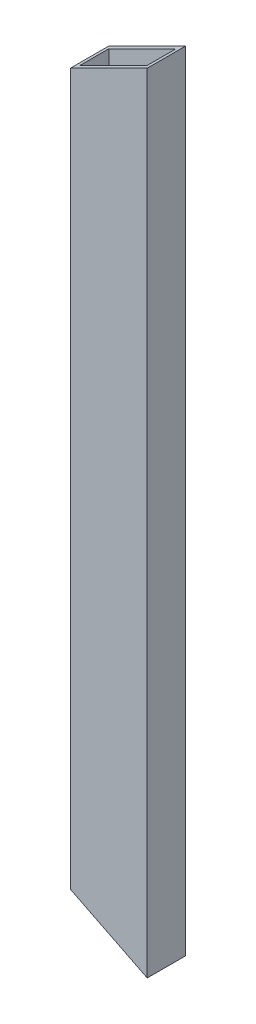
ISO-10303-21;
HEADER;
FILE_DESCRIPTION(('STEP AP214'),'2;1');
FILE_NAME('part.step','',(''),(''),'','','');
FILE_SCHEMA(('AUTOMOTIVE_DESIGN { 1 0 10303 214 1 1 1 1 }'));
ENDSEC;
DATA;
#1=APPLICATION_CONTEXT('core data for automotive mechanical design processes');
#2=APPLICATION_PROTOCOL_DEFINITION('international standard','automotive_design',2000,#1);
#3=PRODUCT_CONTEXT('',#1,'mechanical');
#4=PRODUCT('Part','Part','',(#3));
#5=PRODUCT_RELATED_PRODUCT_CATEGORY('part','',(#4));
#6=PRODUCT_DEFINITION_FORMATION('','',#4);
#7=PRODUCT_DEFINITION_CONTEXT('part definition',#1,'design');
#8=PRODUCT_DEFINITION('design','',#6,#7);
#9=PRODUCT_DEFINITION_SHAPE('','',#8);
#10=(LENGTH_UNIT() NAMED_UNIT(*) SI_UNIT(.MILLI.,.METRE.));
#11=(NAMED_UNIT(*) PLANE_ANGLE_UNIT() SI_UNIT($,.RADIAN.));
#12=(NAMED_UNIT(*) SI_UNIT($,.STERADIAN.) SOLID_ANGLE_UNIT());
#13=UNCERTAINTY_MEASURE_WITH_UNIT(LENGTH_MEASURE(1.E-05),#10,'distance_accuracy_value','');
#14=(GEOMETRIC_REPRESENTATION_CONTEXT(3) GLOBAL_UNCERTAINTY_ASSIGNED_CONTEXT((#13)) GLOBAL_UNIT_ASSIGNED_CONTEXT((#10,
#11,#12)) REPRESENTATION_CONTEXT('',''));
#15=CARTESIAN_POINT('',(0.,0.,0.));
#16=DIRECTION('',(0.,0.,1.));
#17=DIRECTION('',(1.,0.,0.));
#18=AXIS2_PLACEMENT_3D('',#15,#16,#17);
#19=CARTESIAN_POINT('',(0.,520.7,9.525));
#20=DIRECTION('',(0.,0.,-1.));
#21=DIRECTION('',(-1.,0.,0.));
#22=AXIS2_PLACEMENT_3D('',#19,#20,#21);
#23=PLANE('',#22);
#24=DIRECTION('',(0.894427190999916,-0.447213595499958,0.));
#25=VECTOR('',#24,1.);
#26=CARTESIAN_POINT('',(-203.2,114.3,9.525));
#27=LINE('',#26,#25);
#28=CARTESIAN_POINT('',(-22.225,23.8125,9.525));
#29=VERTEX_POINT('',#28);
#30=CARTESIAN_POINT('',(22.225,1.58749999999996,9.525));
#31=VERTEX_POINT('',#30);
#32=EDGE_CURVE('E12',#29,#31,#27,.T.);
#33=ORIENTED_EDGE('',*,*,#32,.F.);
#34=DIRECTION('',(0.,-1.,0.));
#35=VECTOR('',#34,1.);
#36=CARTESIAN_POINT('',(-22.225,520.7,9.525));
#37=LINE('',#36,#35);
#38=CARTESIAN_POINT('',(-22.225,496.8875,9.525));
#39=VERTEX_POINT('',#38);
#40=EDGE_CURVE('E175',#39,#29,#37,.T.);
#41=ORIENTED_EDGE('',*,*,#40,.F.);
#42=DIRECTION('',(-0.894427190999916,-0.447213595499958,0.));
#43=VECTOR('',#42,1.);
#44=CARTESIAN_POINT('',(5.08000000000001,510.54,9.525));
#45=LINE('',#44,#43);
#46=CARTESIAN_POINT('',(22.225,519.1125,9.525));
#47=VERTEX_POINT('',#46);
#48=EDGE_CURVE('E70',#47,#39,#45,.T.);
#49=ORIENTED_EDGE('',*,*,#48,.F.);
#50=DIRECTION('',(0.,-1.,0.));
#51=VECTOR('',#50,1.);
#52=CARTESIAN_POINT('',(22.225,520.7,9.525));
#53=LINE('',#52,#51);
#54=EDGE_CURVE('E180',#47,#31,#53,.T.);
#55=ORIENTED_EDGE('',*,*,#54,.T.);
#56=EDGE_LOOP('',(#33,#41,#49,#55));
#57=FACE_BOUND('',#56,.T.);
#58=ADVANCED_FACE('F62',(#57),#23,.T.);
#59=CARTESIAN_POINT('',(-22.225,520.7,0.));
#60=DIRECTION('',(1.,0.,0.));
#61=DIRECTION('',(0.,0.,-1.));
#62=AXIS2_PLACEMENT_3D('',#59,#60,#61);
#63=PLANE('',#62);
#64=DIRECTION('',(0.,0.,1.));
#65=VECTOR('',#64,1.);
#66=CARTESIAN_POINT('',(-22.225,23.8125,0.));
#67=LINE('',#66,#65);
#68=CARTESIAN_POINT('',(-22.225,23.8125,-9.525));
#69=VERTEX_POINT('',#68);
#70=EDGE_CURVE('E189',#69,#29,#67,.T.);
#71=ORIENTED_EDGE('',*,*,#70,.F.);
#72=DIRECTION('',(0.,-1.,0.));
#73=VECTOR('',#72,1.);
#74=CARTESIAN_POINT('',(-22.225,520.7,-9.525));
#75=LINE('',#74,#73);
#76=CARTESIAN_POINT('',(-22.225,496.8875,-9.525));
#77=VERTEX_POINT('',#76);
#78=EDGE_CURVE('E155',#77,#69,#75,.T.);
#79=ORIENTED_EDGE('',*,*,#78,.F.);
#80=DIRECTION('',(0.,0.,-1.));
#81=VECTOR('',#80,1.);
#82=CARTESIAN_POINT('',(-22.225,496.8875,0.));
#83=LINE('',#82,#81);
#84=EDGE_CURVE('E164',#39,#77,#83,.T.);
#85=ORIENTED_EDGE('',*,*,#84,.F.);
#86=ORIENTED_EDGE('',*,*,#40,.T.);
#87=EDGE_LOOP('',(#71,#79,#85,#86));
#88=FACE_BOUND('',#87,.T.);
#89=ADVANCED_FACE('F174',(#88),#63,.T.);
#90=CARTESIAN_POINT('',(0.,520.7,-9.525));
#91=DIRECTION('',(0.,0.,1.));
#92=DIRECTION('',(1.,0.,0.));
#93=AXIS2_PLACEMENT_3D('',#90,#91,#92);
#94=PLANE('',#93);
#95=DIRECTION('',(-0.894427190999916,0.447213595499958,0.));
#96=VECTOR('',#95,1.);
#97=CARTESIAN_POINT('',(-203.2,114.3,-9.525));
#98=LINE('',#97,#96);
#99=CARTESIAN_POINT('',(22.225,1.58749999999996,-9.525));
#100=VERTEX_POINT('',#99);
#101=EDGE_CURVE('E187',#100,#69,#98,.T.);
#102=ORIENTED_EDGE('',*,*,#101,.F.);
#103=DIRECTION('',(0.,-1.,0.));
#104=VECTOR('',#103,1.);
#105=CARTESIAN_POINT('',(22.225,520.7,-9.525));
#106=LINE('',#105,#104);
#107=CARTESIAN_POINT('',(22.225,519.1125,-9.525));
#108=VERTEX_POINT('',#107);
#109=EDGE_CURVE('E151',#108,#100,#106,.T.);
#110=ORIENTED_EDGE('',*,*,#109,.F.);
#111=DIRECTION('',(0.894427190999916,0.447213595499958,0.));
#112=VECTOR('',#111,1.);
#113=CARTESIAN_POINT('',(5.08000000000001,510.54,-9.525));
#114=LINE('',#113,#112);
#115=EDGE_CURVE('E177',#77,#108,#114,.T.);
#116=ORIENTED_EDGE('',*,*,#115,.F.);
#117=ORIENTED_EDGE('',*,*,#78,.T.);
#118=EDGE_LOOP('',(#102,#110,#116,#117));
#119=FACE_BOUND('',#118,.T.);
#120=ADVANCED_FACE('F212',(#119),#94,.T.);
#121=CARTESIAN_POINT('',(22.225,520.7,0.));
#122=DIRECTION('',(-1.,0.,0.));
#123=DIRECTION('',(0.,0.,1.));
#124=AXIS2_PLACEMENT_3D('',#121,#122,#123);
#125=PLANE('',#124);
#126=DIRECTION('',(0.,0.,-1.));
#127=VECTOR('',#126,1.);
#128=CARTESIAN_POINT('',(22.225,1.58750000000007,0.));
#129=LINE('',#128,#127);
#130=EDGE_CURVE('E183',#31,#100,#129,.T.);
#131=ORIENTED_EDGE('',*,*,#130,.F.);
#132=ORIENTED_EDGE('',*,*,#54,.F.);
#133=DIRECTION('',(0.,0.,1.));
#134=VECTOR('',#133,1.);
#135=CARTESIAN_POINT('',(22.225,519.1125,0.));
#136=LINE('',#135,#134);
#137=EDGE_CURVE('E85',#108,#47,#136,.T.);
#138=ORIENTED_EDGE('',*,*,#137,.F.);
#139=ORIENTED_EDGE('',*,*,#109,.T.);
#140=EDGE_LOOP('',(#131,#132,#138,#139));
#141=FACE_BOUND('',#140,.T.);
#142=ADVANCED_FACE('F204',(#141),#125,.T.);
#143=CARTESIAN_POINT('',(25.4,520.7,-12.7));
#144=DIRECTION('',(0.447213595499958,-0.894427190999916,0.));
#145=DIRECTION('',(0.894427190999916,0.447213595499958,0.));
#146=AXIS2_PLACEMENT_3D('',#143,#144,#145);
#147=PLANE('',#146);
#148=ORIENTED_EDGE('',*,*,#137,.T.);
#149=ORIENTED_EDGE('',*,*,#48,.T.);
#150=ORIENTED_EDGE('',*,*,#84,.T.);
#151=ORIENTED_EDGE('',*,*,#115,.T.);
#152=EDGE_LOOP('',(#148,#149,#150,#151));
#153=FACE_BOUND('',#152,.T.);
#154=DIRECTION('',(0.894427190999916,0.447213595499958,0.));
#155=VECTOR('',#154,1.);
#156=CARTESIAN_POINT('',(25.4,520.7,12.7));
#157=LINE('',#156,#155);
#158=CARTESIAN_POINT('',(-25.4,495.3,12.7));
#159=VERTEX_POINT('',#158);
#160=CARTESIAN_POINT('',(25.4,520.7,12.7));
#161=VERTEX_POINT('',#160);
#162=EDGE_CURVE('E194',#159,#161,#157,.T.);
#163=ORIENTED_EDGE('',*,*,#162,.T.);
#164=DIRECTION('',(0.,0.,-1.));
#165=VECTOR('',#164,1.);
#166=CARTESIAN_POINT('',(25.4,520.7,12.7));
#167=LINE('',#166,#165);
#168=CARTESIAN_POINT('',(25.4,520.7,-12.7));
#169=VERTEX_POINT('',#168);
#170=EDGE_CURVE('E150',#161,#169,#167,.T.);
#171=ORIENTED_EDGE('',*,*,#170,.T.);
#172=DIRECTION('',(0.894427190999916,0.447213595499958,0.));
#173=VECTOR('',#172,1.);
#174=CARTESIAN_POINT('',(25.4,520.7,-12.7));
#175=LINE('',#174,#173);
#176=CARTESIAN_POINT('',(-25.4,495.3,-12.7));
#177=VERTEX_POINT('',#176);
#178=EDGE_CURVE('E142',#177,#169,#175,.T.);
#179=ORIENTED_EDGE('',*,*,#178,.F.);
#180=DIRECTION('',(0.,0.,1.));
#181=VECTOR('',#180,1.);
#182=CARTESIAN_POINT('',(-25.4,495.3,-12.7));
#183=LINE('',#182,#181);
#184=EDGE_CURVE('E77',#177,#159,#183,.T.);
#185=ORIENTED_EDGE('',*,*,#184,.T.);
#186=EDGE_LOOP('',(#163,#171,#179,#185));
#187=FACE_BOUND('',#186,.T.);
#188=ADVANCED_FACE('F163',(#153,#187),#147,.F.);
#189=CARTESIAN_POINT('',(25.4,0.,-12.7));
#190=DIRECTION('',(0.447213595499958,0.894427190999916,0.));
#191=DIRECTION('',(-0.894427190999916,0.447213595499958,0.));
#192=AXIS2_PLACEMENT_3D('',#189,#190,#191);
#193=PLANE('',#192);
#194=ORIENTED_EDGE('',*,*,#130,.T.);
#195=ORIENTED_EDGE('',*,*,#101,.T.);
#196=ORIENTED_EDGE('',*,*,#70,.T.);
#197=ORIENTED_EDGE('',*,*,#32,.T.);
#198=EDGE_LOOP('',(#194,#195,#196,#197));
#199=FACE_BOUND('',#198,.T.);
#200=DIRECTION('',(-0.894427190999916,0.447213595499958,0.));
#201=VECTOR('',#200,1.);
#202=CARTESIAN_POINT('',(25.4,0.,12.7));
#203=LINE('',#202,#201);
#204=CARTESIAN_POINT('',(25.4,0.,12.7));
#205=VERTEX_POINT('',#204);
#206=CARTESIAN_POINT('',(-25.4,25.4,12.7));
#207=VERTEX_POINT('',#206);
#208=EDGE_CURVE('E136',#205,#207,#203,.T.);
#209=ORIENTED_EDGE('',*,*,#208,.T.);
#210=DIRECTION('',(0.,0.,1.));
#211=VECTOR('',#210,1.);
#212=CARTESIAN_POINT('',(-25.4,25.4,-12.7));
#213=LINE('',#212,#211);
#214=CARTESIAN_POINT('',(-25.4,25.4,-12.7));
#215=VERTEX_POINT('',#214);
#216=EDGE_CURVE('E132',#215,#207,#213,.T.);
#217=ORIENTED_EDGE('',*,*,#216,.F.);
#218=DIRECTION('',(-0.894427190999916,0.447213595499958,0.));
#219=VECTOR('',#218,1.);
#220=CARTESIAN_POINT('',(25.4,0.,-12.7));
#221=LINE('',#220,#219);
#222=CARTESIAN_POINT('',(25.4,0.,-12.7));
#223=VERTEX_POINT('',#222);
#224=EDGE_CURVE('E125',#223,#215,#221,.T.);
#225=ORIENTED_EDGE('',*,*,#224,.F.);
#226=DIRECTION('',(0.,0.,-1.));
#227=VECTOR('',#226,1.);
#228=CARTESIAN_POINT('',(25.4,0.,12.7));
#229=LINE('',#228,#227);
#230=EDGE_CURVE('E129',#205,#223,#229,.T.);
#231=ORIENTED_EDGE('',*,*,#230,.F.);
#232=EDGE_LOOP('',(#209,#217,#225,#231));
#233=FACE_BOUND('',#232,.T.);
#234=ADVANCED_FACE('F127',(#199,#233),#193,.F.);
#235=CARTESIAN_POINT('',(25.4,520.7,12.7));
#236=DIRECTION('',(-1.,0.,0.));
#237=DIRECTION('',(0.,0.,1.));
#238=AXIS2_PLACEMENT_3D('',#235,#236,#237);
#239=PLANE('',#238);
#240=ORIENTED_EDGE('',*,*,#230,.T.);
#241=DIRECTION('',(0.,-1.,0.));
#242=VECTOR('',#241,1.);
#243=CARTESIAN_POINT('',(25.4,520.7,-12.7));
#244=LINE('',#243,#242);
#245=EDGE_CURVE('E140',#169,#223,#244,.T.);
#246=ORIENTED_EDGE('',*,*,#245,.F.);
#247=ORIENTED_EDGE('',*,*,#170,.F.);
#248=DIRECTION('',(0.,-1.,0.));
#249=VECTOR('',#248,1.);
#250=CARTESIAN_POINT('',(25.4,520.7,12.7));
#251=LINE('',#250,#249);
#252=EDGE_CURVE('E149',#161,#205,#251,.T.);
#253=ORIENTED_EDGE('',*,*,#252,.T.);
#254=EDGE_LOOP('',(#240,#246,#247,#253));
#255=FACE_BOUND('',#254,.T.);
#256=ADVANCED_FACE('F64',(#255),#239,.F.);
#257=CARTESIAN_POINT('',(-25.4,520.7,-12.7));
#258=DIRECTION('',(0.,0.,1.));
#259=DIRECTION('',(1.,0.,0.));
#260=AXIS2_PLACEMENT_3D('',#257,#258,#259);
#261=PLANE('',#260);
#262=ORIENTED_EDGE('',*,*,#245,.T.);
#263=ORIENTED_EDGE('',*,*,#224,.T.);
#264=DIRECTION('',(0.,-1.,0.));
#265=VECTOR('',#264,1.);
#266=CARTESIAN_POINT('',(-25.4,520.7,-12.7));
#267=LINE('',#266,#265);
#268=EDGE_CURVE('E145',#177,#215,#267,.T.);
#269=ORIENTED_EDGE('',*,*,#268,.F.);
#270=ORIENTED_EDGE('',*,*,#178,.T.);
#271=EDGE_LOOP('',(#262,#263,#269,#270));
#272=FACE_BOUND('',#271,.T.);
#273=ADVANCED_FACE('F141',(#272),#261,.F.);
#274=CARTESIAN_POINT('',(-25.4,520.7,12.7));
#275=DIRECTION('',(1.,0.,0.));
#276=DIRECTION('',(0.,0.,-1.));
#277=AXIS2_PLACEMENT_3D('',#274,#275,#276);
#278=PLANE('',#277);
#279=ORIENTED_EDGE('',*,*,#268,.T.);
#280=ORIENTED_EDGE('',*,*,#216,.T.);
#281=DIRECTION('',(0.,-1.,0.));
#282=VECTOR('',#281,1.);
#283=CARTESIAN_POINT('',(-25.4,520.7,12.7));
#284=LINE('',#283,#282);
#285=EDGE_CURVE('E159',#159,#207,#284,.T.);
#286=ORIENTED_EDGE('',*,*,#285,.F.);
#287=ORIENTED_EDGE('',*,*,#184,.F.);
#288=EDGE_LOOP('',(#279,#280,#286,#287));
#289=FACE_BOUND('',#288,.T.);
#290=ADVANCED_FACE('F201',(#289),#278,.F.);
#291=CARTESIAN_POINT('',(-25.4,520.7,12.7));
#292=DIRECTION('',(0.,0.,-1.));
#293=DIRECTION('',(-1.,0.,0.));
#294=AXIS2_PLACEMENT_3D('',#291,#292,#293);
#295=PLANE('',#294);
#296=ORIENTED_EDGE('',*,*,#285,.T.);
#297=ORIENTED_EDGE('',*,*,#208,.F.);
#298=ORIENTED_EDGE('',*,*,#252,.F.);
#299=ORIENTED_EDGE('',*,*,#162,.F.);
#300=EDGE_LOOP('',(#296,#297,#298,#299));
#301=FACE_BOUND('',#300,.T.);
#302=ADVANCED_FACE('F202',(#301),#295,.F.);
#303=CLOSED_SHELL('',(#58,#89,#120,#142,#188,#234,#256,#273,#290,#302));
#304=MANIFOLD_SOLID_BREP('B2',#303);
#305=ADVANCED_BREP_SHAPE_REPRESENTATION('',(#18,#304),#14);
#306=SHAPE_DEFINITION_REPRESENTATION(#9,#305);
ENDSEC;
END-ISO-10303-21;
